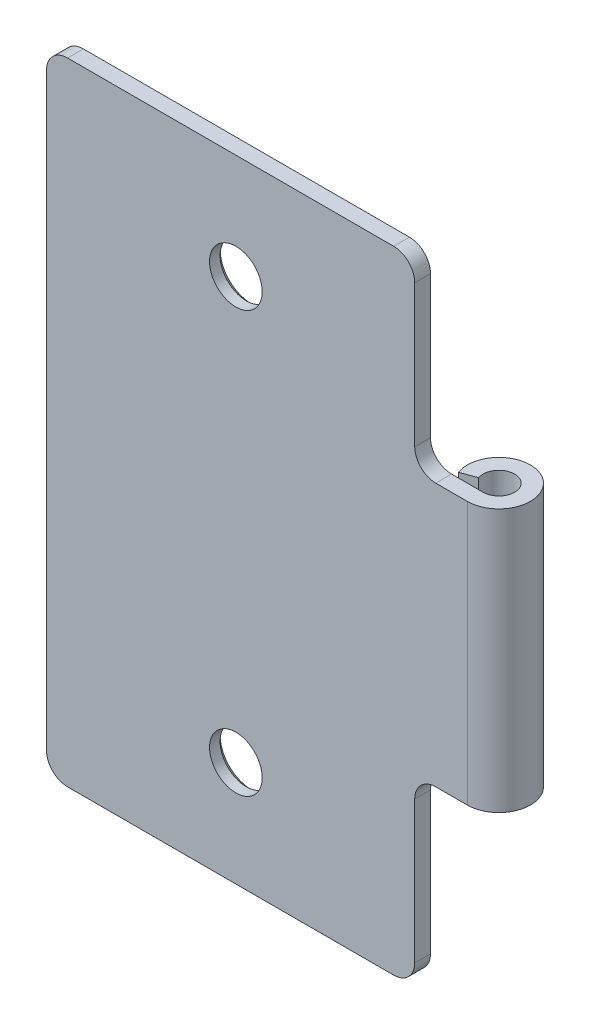
ISO-10303-21;
HEADER;
FILE_DESCRIPTION(('STEP AP214'),'2;1');
FILE_NAME('part.step','',(''),(''),'','','');
FILE_SCHEMA(('AUTOMOTIVE_DESIGN { 1 0 10303 214 1 1 1 1 }'));
ENDSEC;
DATA;
#1=APPLICATION_CONTEXT('core data for automotive mechanical design processes');
#2=APPLICATION_PROTOCOL_DEFINITION('international standard','automotive_design',2000,#1);
#3=PRODUCT_CONTEXT('',#1,'mechanical');
#4=PRODUCT('Part','Part','',(#3));
#5=PRODUCT_RELATED_PRODUCT_CATEGORY('part','',(#4));
#6=PRODUCT_DEFINITION_FORMATION('','',#4);
#7=PRODUCT_DEFINITION_CONTEXT('part definition',#1,'design');
#8=PRODUCT_DEFINITION('design','',#6,#7);
#9=PRODUCT_DEFINITION_SHAPE('','',#8);
#10=(LENGTH_UNIT() NAMED_UNIT(*) SI_UNIT(.MILLI.,.METRE.));
#11=(NAMED_UNIT(*) PLANE_ANGLE_UNIT() SI_UNIT($,.RADIAN.));
#12=(NAMED_UNIT(*) SI_UNIT($,.STERADIAN.) SOLID_ANGLE_UNIT());
#13=UNCERTAINTY_MEASURE_WITH_UNIT(LENGTH_MEASURE(1.E-05),#10,'distance_accuracy_value','');
#14=(GEOMETRIC_REPRESENTATION_CONTEXT(3) GLOBAL_UNCERTAINTY_ASSIGNED_CONTEXT((#13)) GLOBAL_UNIT_ASSIGNED_CONTEXT((#10,
#11,#12)) REPRESENTATION_CONTEXT('',''));
#15=CARTESIAN_POINT('',(0.,0.,0.));
#16=DIRECTION('',(0.,0.,1.));
#17=DIRECTION('',(1.,0.,0.));
#18=AXIS2_PLACEMENT_3D('',#15,#16,#17);
#19=CARTESIAN_POINT('',(10.3135852294402,-1.25,0.15));
#20=DIRECTION('',(0.,1.,0.));
#21=DIRECTION('',(0.,0.,1.));
#22=AXIS2_PLACEMENT_3D('',#19,#20,#21);
#23=PLANE('',#22);
#24=DIRECTION('',(1.,0.,0.));
#25=VECTOR('',#24,1.);
#26=CARTESIAN_POINT('',(10.3135852294402,-1.25,0.15));
#27=LINE('',#26,#25);
#28=CARTESIAN_POINT('',(9.71358522944015,-1.25,0.15));
#29=VERTEX_POINT('',#28);
#30=CARTESIAN_POINT('',(10.0135852294402,-1.25,0.15));
#31=VERTEX_POINT('',#30);
#32=EDGE_CURVE('E156',#29,#31,#27,.T.);
#33=ORIENTED_EDGE('',*,*,#32,.F.);
#34=DIRECTION('',(0.,0.,-1.));
#35=VECTOR('',#34,1.);
#36=CARTESIAN_POINT('',(9.71358522944015,-1.25,0.));
#37=LINE('',#36,#35);
#38=CARTESIAN_POINT('',(9.71358522944015,-1.25,0.));
#39=VERTEX_POINT('',#38);
#40=EDGE_CURVE('E250',#29,#39,#37,.T.);
#41=ORIENTED_EDGE('',*,*,#40,.T.);
#42=DIRECTION('',(1.,0.,0.));
#43=VECTOR('',#42,1.);
#44=CARTESIAN_POINT('',(10.0135852294402,-1.25,0.));
#45=LINE('',#44,#43);
#46=CARTESIAN_POINT('',(10.0135852294402,-1.25,0.));
#47=VERTEX_POINT('',#46);
#48=EDGE_CURVE('E173',#39,#47,#45,.T.);
#49=ORIENTED_EDGE('',*,*,#48,.T.);
#50=DIRECTION('',(0.,0.,1.));
#51=VECTOR('',#50,1.);
#52=CARTESIAN_POINT('',(10.0135852294402,-1.25,0.));
#53=LINE('',#52,#51);
#54=EDGE_CURVE('E170',#47,#31,#53,.T.);
#55=ORIENTED_EDGE('',*,*,#54,.T.);
#56=EDGE_LOOP('',(#33,#41,#49,#55));
#57=FACE_BOUND('',#56,.T.);
#58=ADVANCED_FACE('F45',(#57),#23,.F.);
#59=CARTESIAN_POINT('',(10.0135852294402,3.,-0.15));
#60=DIRECTION('',(0.,-1.,0.));
#61=DIRECTION('',(0.,0.,-1.));
#62=AXIS2_PLACEMENT_3D('',#59,#60,#61);
#63=CYLINDRICAL_SURFACE('',#62,0.3);
#64=DIRECTION('',(0.,-1.,0.));
#65=VECTOR('',#64,1.);
#66=CARTESIAN_POINT('',(9.73167744320438,3.,-0.0473939570023011));
#67=LINE('',#66,#65);
#68=CARTESIAN_POINT('',(9.73167744320438,1.25,-0.0473939570023012));
#69=VERTEX_POINT('',#68);
#70=CARTESIAN_POINT('',(9.73167744320438,-1.25,-0.0473939570023012));
#71=VERTEX_POINT('',#70);
#72=EDGE_CURVE('E177',#69,#71,#67,.T.);
#73=ORIENTED_EDGE('',*,*,#72,.F.);
#74=CARTESIAN_POINT('',(10.0135852294402,1.25,-0.15));
#75=DIRECTION('',(0.,-1.,0.));
#76=DIRECTION('',(0.,0.,-1.));
#77=AXIS2_PLACEMENT_3D('',#74,#75,#76);
#78=CIRCLE('',#77,0.3);
#79=CARTESIAN_POINT('',(10.0135852294402,1.25,0.15));
#80=VERTEX_POINT('',#79);
#81=EDGE_CURVE('E191',#69,#80,#78,.T.);
#82=ORIENTED_EDGE('',*,*,#81,.T.);
#83=DIRECTION('',(0.,-1.,0.));
#84=VECTOR('',#83,1.);
#85=CARTESIAN_POINT('',(10.0135852294402,3.,0.15));
#86=LINE('',#85,#84);
#87=EDGE_CURVE('E162',#80,#31,#86,.T.);
#88=ORIENTED_EDGE('',*,*,#87,.T.);
#89=CARTESIAN_POINT('',(10.0135852294402,-1.25,-0.15));
#90=DIRECTION('',(0.,1.,0.));
#91=DIRECTION('',(0.,0.,1.));
#92=AXIS2_PLACEMENT_3D('',#89,#90,#91);
#93=CIRCLE('',#92,0.3);
#94=EDGE_CURVE('E180',#31,#71,#93,.T.);
#95=ORIENTED_EDGE('',*,*,#94,.T.);
#96=EDGE_LOOP('',(#73,#82,#88,#95));
#97=FACE_BOUND('',#96,.T.);
#98=ADVANCED_FACE('F190',(#97),#63,.T.);
#99=CARTESIAN_POINT('',(9.87263133632226,3.,-0.0986969785011506));
#100=DIRECTION('',(0.342020143325664,0.,0.93969262078591));
#101=DIRECTION('',(0.93969262078591,0.,-0.342020143325664));
#102=AXIS2_PLACEMENT_3D('',#99,#100,#101);
#103=PLANE('',#102);
#104=DIRECTION('',(0.93969262078591,0.,-0.342020143325664));
#105=VECTOR('',#104,1.);
#106=CARTESIAN_POINT('',(9.87263133632226,1.25,-0.0986969785011506));
#107=LINE('',#106,#105);
#108=CARTESIAN_POINT('',(9.87263133632226,1.25,-0.0986969785011505));
#109=VERTEX_POINT('',#108);
#110=EDGE_CURVE('E354',#69,#109,#107,.T.);
#111=ORIENTED_EDGE('',*,*,#110,.F.);
#112=ORIENTED_EDGE('',*,*,#72,.T.);
#113=DIRECTION('',(-0.93969262078591,0.,0.342020143325664));
#114=VECTOR('',#113,1.);
#115=CARTESIAN_POINT('',(9.87263133632226,-1.25,-0.0986969785011506));
#116=LINE('',#115,#114);
#117=CARTESIAN_POINT('',(9.87263133632226,-1.25,-0.0986969785011505));
#118=VERTEX_POINT('',#117);
#119=EDGE_CURVE('E183',#118,#71,#116,.T.);
#120=ORIENTED_EDGE('',*,*,#119,.F.);
#121=DIRECTION('',(0.,-1.,0.));
#122=VECTOR('',#121,1.);
#123=CARTESIAN_POINT('',(9.87263133632226,3.,-0.0986969785011506));
#124=LINE('',#123,#122);
#125=EDGE_CURVE('E210',#109,#118,#124,.T.);
#126=ORIENTED_EDGE('',*,*,#125,.F.);
#127=EDGE_LOOP('',(#111,#112,#120,#126));
#128=FACE_BOUND('',#127,.T.);
#129=ADVANCED_FACE('F291',(#128),#103,.T.);
#130=CARTESIAN_POINT('',(10.0135852294402,3.,-0.15));
#131=DIRECTION('',(0.,-1.,0.));
#132=DIRECTION('',(0.,0.,-1.));
#133=AXIS2_PLACEMENT_3D('',#130,#131,#132);
#134=CYLINDRICAL_SURFACE('',#133,0.15);
#135=CARTESIAN_POINT('',(10.0135852294402,1.25,-0.15));
#136=DIRECTION('',(0.,-1.,0.));
#137=DIRECTION('',(0.,0.,-1.));
#138=AXIS2_PLACEMENT_3D('',#135,#136,#137);
#139=CIRCLE('',#138,0.15);
#140=CARTESIAN_POINT('',(10.0135852294402,1.25,0.));
#141=VERTEX_POINT('',#140);
#142=EDGE_CURVE('E352',#109,#141,#139,.T.);
#143=ORIENTED_EDGE('',*,*,#142,.F.);
#144=ORIENTED_EDGE('',*,*,#125,.T.);
#145=CARTESIAN_POINT('',(10.0135852294402,-1.25,-0.15));
#146=DIRECTION('',(0.,1.,0.));
#147=DIRECTION('',(0.,0.,1.));
#148=AXIS2_PLACEMENT_3D('',#145,#146,#147);
#149=CIRCLE('',#148,0.15);
#150=EDGE_CURVE('E347',#47,#118,#149,.T.);
#151=ORIENTED_EDGE('',*,*,#150,.F.);
#152=DIRECTION('',(0.,-1.,0.));
#153=VECTOR('',#152,1.);
#154=CARTESIAN_POINT('',(10.0135852294402,3.,0.));
#155=LINE('',#154,#153);
#156=EDGE_CURVE('E207',#141,#47,#155,.T.);
#157=ORIENTED_EDGE('',*,*,#156,.F.);
#158=EDGE_LOOP('',(#143,#144,#151,#157));
#159=FACE_BOUND('',#158,.T.);
#160=ADVANCED_FACE('F319',(#159),#134,.F.);
#161=CARTESIAN_POINT('',(10.0135852294402,3.,0.));
#162=DIRECTION('',(0.,0.,-1.));
#163=DIRECTION('',(-1.,0.,0.));
#164=AXIS2_PLACEMENT_3D('',#161,#162,#163);
#165=PLANE('',#164);
#166=CARTESIAN_POINT('',(7.81358522944015,2.,0.));
#167=DIRECTION('',(0.,0.,-1.));
#168=DIRECTION('',(-1.,0.,0.));
#169=AXIS2_PLACEMENT_3D('',#166,#167,#168);
#170=CIRCLE('',#169,0.3);
#171=CARTESIAN_POINT('',(7.51358522944015,2.,0.));
#172=VERTEX_POINT('',#171);
#173=EDGE_CURVE('E400',#172,#172,#170,.T.);
#174=ORIENTED_EDGE('',*,*,#173,.F.);
#175=EDGE_LOOP('',(#174));
#176=FACE_BOUND('',#175,.T.);
#177=CARTESIAN_POINT('',(7.81358522944015,-2.,0.));
#178=DIRECTION('',(0.,0.,-1.));
#179=DIRECTION('',(-1.,0.,0.));
#180=AXIS2_PLACEMENT_3D('',#177,#178,#179);
#181=CIRCLE('',#180,0.3);
#182=CARTESIAN_POINT('',(7.51358522944015,-2.,0.));
#183=VERTEX_POINT('',#182);
#184=EDGE_CURVE('E391',#183,#183,#181,.T.);
#185=ORIENTED_EDGE('',*,*,#184,.F.);
#186=EDGE_LOOP('',(#185));
#187=FACE_BOUND('',#186,.T.);
#188=DIRECTION('',(1.,0.,0.));
#189=VECTOR('',#188,1.);
#190=CARTESIAN_POINT('',(10.0135852294402,3.,0.));
#191=LINE('',#190,#189);
#192=CARTESIAN_POINT('',(6.21358522944015,3.,0.));
#193=VERTEX_POINT('',#192);
#194=CARTESIAN_POINT('',(9.31358522944015,3.,0.));
#195=VERTEX_POINT('',#194);
#196=EDGE_CURVE('E199',#193,#195,#191,.T.);
#197=ORIENTED_EDGE('',*,*,#196,.T.);
#198=CARTESIAN_POINT('',(9.31358522944015,2.8,0.));
#199=DIRECTION('',(0.,0.,-1.));
#200=DIRECTION('',(-1.,0.,0.));
#201=AXIS2_PLACEMENT_3D('',#198,#199,#200);
#202=CIRCLE('',#201,0.2);
#203=CARTESIAN_POINT('',(9.51358522944015,2.8,0.));
#204=VERTEX_POINT('',#203);
#205=EDGE_CURVE('E224',#195,#204,#202,.T.);
#206=ORIENTED_EDGE('',*,*,#205,.T.);
#207=DIRECTION('',(0.,1.,0.));
#208=VECTOR('',#207,1.);
#209=CARTESIAN_POINT('',(9.51358522944015,3.,0.));
#210=LINE('',#209,#208);
#211=CARTESIAN_POINT('',(9.51358522944015,1.45,0.));
#212=VERTEX_POINT('',#211);
#213=EDGE_CURVE('E268',#212,#204,#210,.T.);
#214=ORIENTED_EDGE('',*,*,#213,.F.);
#215=CARTESIAN_POINT('',(9.71358522944015,1.45,0.));
#216=DIRECTION('',(0.,0.,-1.));
#217=DIRECTION('',(-1.,0.,0.));
#218=AXIS2_PLACEMENT_3D('',#215,#216,#217);
#219=CIRCLE('',#218,0.2);
#220=CARTESIAN_POINT('',(9.71358522944015,1.25,0.));
#221=VERTEX_POINT('',#220);
#222=EDGE_CURVE('E257',#212,#221,#219,.F.);
#223=ORIENTED_EDGE('',*,*,#222,.T.);
#224=DIRECTION('',(-1.,0.,0.));
#225=VECTOR('',#224,1.);
#226=CARTESIAN_POINT('',(10.0135852294402,1.25,0.));
#227=LINE('',#226,#225);
#228=EDGE_CURVE('E187',#141,#221,#227,.T.);
#229=ORIENTED_EDGE('',*,*,#228,.F.);
#230=ORIENTED_EDGE('',*,*,#156,.T.);
#231=ORIENTED_EDGE('',*,*,#48,.F.);
#232=CARTESIAN_POINT('',(9.71358522944015,-1.45,0.));
#233=DIRECTION('',(0.,0.,-1.));
#234=DIRECTION('',(-1.,0.,0.));
#235=AXIS2_PLACEMENT_3D('',#232,#233,#234);
#236=CIRCLE('',#235,0.2);
#237=CARTESIAN_POINT('',(9.51358522944015,-1.45,0.));
#238=VERTEX_POINT('',#237);
#239=EDGE_CURVE('E53',#39,#238,#236,.F.);
#240=ORIENTED_EDGE('',*,*,#239,.T.);
#241=DIRECTION('',(0.,1.,0.));
#242=VECTOR('',#241,1.);
#243=CARTESIAN_POINT('',(9.51358522944015,3.,0.));
#244=LINE('',#243,#242);
#245=CARTESIAN_POINT('',(9.51358522944015,-2.8,0.));
#246=VERTEX_POINT('',#245);
#247=EDGE_CURVE('E264',#246,#238,#244,.T.);
#248=ORIENTED_EDGE('',*,*,#247,.F.);
#249=CARTESIAN_POINT('',(9.31358522944015,-2.8,0.));
#250=DIRECTION('',(0.,0.,-1.));
#251=DIRECTION('',(-1.,0.,0.));
#252=AXIS2_PLACEMENT_3D('',#249,#250,#251);
#253=CIRCLE('',#252,0.2);
#254=CARTESIAN_POINT('',(9.31358522944015,-3.,0.));
#255=VERTEX_POINT('',#254);
#256=EDGE_CURVE('E222',#246,#255,#253,.T.);
#257=ORIENTED_EDGE('',*,*,#256,.T.);
#258=DIRECTION('',(1.,0.,0.));
#259=VECTOR('',#258,1.);
#260=CARTESIAN_POINT('',(10.0135852294402,-3.,0.));
#261=LINE('',#260,#259);
#262=CARTESIAN_POINT('',(6.21358522944015,-3.,0.));
#263=VERTEX_POINT('',#262);
#264=EDGE_CURVE('E357',#263,#255,#261,.T.);
#265=ORIENTED_EDGE('',*,*,#264,.F.);
#266=CARTESIAN_POINT('',(6.21358522944015,-2.8,0.));
#267=DIRECTION('',(0.,0.,-1.));
#268=DIRECTION('',(-1.,0.,0.));
#269=AXIS2_PLACEMENT_3D('',#266,#267,#268);
#270=CIRCLE('',#269,0.2);
#271=CARTESIAN_POINT('',(6.01358522944015,-2.8,0.));
#272=VERTEX_POINT('',#271);
#273=EDGE_CURVE('E218',#263,#272,#270,.T.);
#274=ORIENTED_EDGE('',*,*,#273,.T.);
#275=DIRECTION('',(0.,-1.,0.));
#276=VECTOR('',#275,1.);
#277=CARTESIAN_POINT('',(6.01358522944015,3.,0.));
#278=LINE('',#277,#276);
#279=CARTESIAN_POINT('',(6.01358522944015,2.8,0.));
#280=VERTEX_POINT('',#279);
#281=EDGE_CURVE('E196',#280,#272,#278,.T.);
#282=ORIENTED_EDGE('',*,*,#281,.F.);
#283=CARTESIAN_POINT('',(6.21358522944015,2.8,0.));
#284=DIRECTION('',(0.,0.,-1.));
#285=DIRECTION('',(-1.,0.,0.));
#286=AXIS2_PLACEMENT_3D('',#283,#284,#285);
#287=CIRCLE('',#286,0.2);
#288=EDGE_CURVE('E220',#280,#193,#287,.T.);
#289=ORIENTED_EDGE('',*,*,#288,.T.);
#290=EDGE_LOOP('',(#197,#206,#214,#223,#229,#230,#231,#240,#248,#257,#265,#274,#282,#289));
#291=FACE_BOUND('',#290,.T.);
#292=ADVANCED_FACE('F263',(#176,#187,#291),#165,.T.);
#293=CARTESIAN_POINT('',(6.01358522944015,3.,0.15));
#294=DIRECTION('',(-1.,0.,0.));
#295=DIRECTION('',(0.,0.,1.));
#296=AXIS2_PLACEMENT_3D('',#293,#294,#295);
#297=PLANE('',#296);
#298=DIRECTION('',(0.,-1.,0.));
#299=VECTOR('',#298,1.);
#300=CARTESIAN_POINT('',(6.01358522944015,3.,0.15));
#301=LINE('',#300,#299);
#302=CARTESIAN_POINT('',(6.01358522944015,2.8,0.15));
#303=VERTEX_POINT('',#302);
#304=CARTESIAN_POINT('',(6.01358522944015,-2.8,0.15));
#305=VERTEX_POINT('',#304);
#306=EDGE_CURVE('E192',#303,#305,#301,.T.);
#307=ORIENTED_EDGE('',*,*,#306,.F.);
#308=DIRECTION('',(0.,0.,-1.));
#309=VECTOR('',#308,1.);
#310=CARTESIAN_POINT('',(6.01358522944015,2.8,0.15));
#311=LINE('',#310,#309);
#312=EDGE_CURVE('E254',#303,#280,#311,.T.);
#313=ORIENTED_EDGE('',*,*,#312,.T.);
#314=ORIENTED_EDGE('',*,*,#281,.T.);
#315=DIRECTION('',(0.,0.,-1.));
#316=VECTOR('',#315,1.);
#317=CARTESIAN_POINT('',(6.01358522944015,-2.8,0.15));
#318=LINE('',#317,#316);
#319=EDGE_CURVE('E252',#272,#305,#318,.F.);
#320=ORIENTED_EDGE('',*,*,#319,.T.);
#321=EDGE_LOOP('',(#307,#313,#314,#320));
#322=FACE_BOUND('',#321,.T.);
#323=ADVANCED_FACE('F313',(#322),#297,.T.);
#324=CARTESIAN_POINT('',(10.0135852294402,3.,0.15));
#325=DIRECTION('',(0.,0.,-1.));
#326=DIRECTION('',(-1.,0.,0.));
#327=AXIS2_PLACEMENT_3D('',#324,#325,#326);
#328=PLANE('',#327);
#329=CARTESIAN_POINT('',(7.81358522944015,2.,0.15));
#330=DIRECTION('',(0.,0.,-1.));
#331=DIRECTION('',(-1.,0.,0.));
#332=AXIS2_PLACEMENT_3D('',#329,#330,#331);
#333=CIRCLE('',#332,0.25);
#334=CARTESIAN_POINT('',(7.56358522944015,2.,0.15));
#335=VERTEX_POINT('',#334);
#336=EDGE_CURVE('E394',#335,#335,#333,.T.);
#337=ORIENTED_EDGE('',*,*,#336,.T.);
#338=EDGE_LOOP('',(#337));
#339=FACE_BOUND('',#338,.T.);
#340=CARTESIAN_POINT('',(7.81358522944015,-2.,0.15));
#341=DIRECTION('',(0.,0.,-1.));
#342=DIRECTION('',(-1.,0.,0.));
#343=AXIS2_PLACEMENT_3D('',#340,#341,#342);
#344=CIRCLE('',#343,0.25);
#345=CARTESIAN_POINT('',(7.56358522944015,-2.,0.15));
#346=VERTEX_POINT('',#345);
#347=EDGE_CURVE('E167',#346,#346,#344,.T.);
#348=ORIENTED_EDGE('',*,*,#347,.T.);
#349=EDGE_LOOP('',(#348));
#350=FACE_BOUND('',#349,.T.);
#351=DIRECTION('',(0.,1.,0.));
#352=VECTOR('',#351,1.);
#353=CARTESIAN_POINT('',(9.51358522944015,1.25,0.15));
#354=LINE('',#353,#352);
#355=CARTESIAN_POINT('',(9.51358522944015,1.45,0.15));
#356=VERTEX_POINT('',#355);
#357=CARTESIAN_POINT('',(9.51358522944015,2.8,0.15));
#358=VERTEX_POINT('',#357);
#359=EDGE_CURVE('E269',#356,#358,#354,.T.);
#360=ORIENTED_EDGE('',*,*,#359,.T.);
#361=CARTESIAN_POINT('',(9.31358522944015,2.8,0.15));
#362=DIRECTION('',(0.,0.,-1.));
#363=DIRECTION('',(-1.,0.,0.));
#364=AXIS2_PLACEMENT_3D('',#361,#362,#363);
#365=CIRCLE('',#364,0.2);
#366=CARTESIAN_POINT('',(9.31358522944015,3.,0.15));
#367=VERTEX_POINT('',#366);
#368=EDGE_CURVE('E237',#358,#367,#365,.F.);
#369=ORIENTED_EDGE('',*,*,#368,.T.);
#370=DIRECTION('',(1.,0.,0.));
#371=VECTOR('',#370,1.);
#372=CARTESIAN_POINT('',(10.0135852294402,3.,0.15));
#373=LINE('',#372,#371);
#374=CARTESIAN_POINT('',(6.21358522944015,3.,0.15));
#375=VERTEX_POINT('',#374);
#376=EDGE_CURVE('E193',#375,#367,#373,.T.);
#377=ORIENTED_EDGE('',*,*,#376,.F.);
#378=CARTESIAN_POINT('',(6.21358522944015,2.8,0.15));
#379=DIRECTION('',(0.,0.,-1.));
#380=DIRECTION('',(-1.,0.,0.));
#381=AXIS2_PLACEMENT_3D('',#378,#379,#380);
#382=CIRCLE('',#381,0.2);
#383=EDGE_CURVE('E233',#375,#303,#382,.F.);
#384=ORIENTED_EDGE('',*,*,#383,.T.);
#385=ORIENTED_EDGE('',*,*,#306,.T.);
#386=CARTESIAN_POINT('',(6.21358522944015,-2.8,0.15));
#387=DIRECTION('',(0.,0.,-1.));
#388=DIRECTION('',(-1.,0.,0.));
#389=AXIS2_PLACEMENT_3D('',#386,#387,#388);
#390=CIRCLE('',#389,0.2);
#391=CARTESIAN_POINT('',(6.21358522944015,-3.,0.15));
#392=VERTEX_POINT('',#391);
#393=EDGE_CURVE('E231',#305,#392,#390,.F.);
#394=ORIENTED_EDGE('',*,*,#393,.T.);
#395=DIRECTION('',(1.,0.,0.));
#396=VECTOR('',#395,1.);
#397=CARTESIAN_POINT('',(10.0135852294402,-3.,0.15));
#398=LINE('',#397,#396);
#399=CARTESIAN_POINT('',(9.31358522944015,-3.,0.15));
#400=VERTEX_POINT('',#399);
#401=EDGE_CURVE('E202',#392,#400,#398,.T.);
#402=ORIENTED_EDGE('',*,*,#401,.T.);
#403=CARTESIAN_POINT('',(9.31358522944015,-2.8,0.15));
#404=DIRECTION('',(0.,0.,-1.));
#405=DIRECTION('',(-1.,0.,0.));
#406=AXIS2_PLACEMENT_3D('',#403,#404,#405);
#407=CIRCLE('',#406,0.2);
#408=CARTESIAN_POINT('',(9.51358522944015,-2.8,0.15));
#409=VERTEX_POINT('',#408);
#410=EDGE_CURVE('E235',#400,#409,#407,.F.);
#411=ORIENTED_EDGE('',*,*,#410,.T.);
#412=DIRECTION('',(0.,1.,0.));
#413=VECTOR('',#412,1.);
#414=CARTESIAN_POINT('',(9.51358522944015,-1.25,0.15));
#415=LINE('',#414,#413);
#416=CARTESIAN_POINT('',(9.51358522944015,-1.45,0.15));
#417=VERTEX_POINT('',#416);
#418=EDGE_CURVE('E166',#409,#417,#415,.T.);
#419=ORIENTED_EDGE('',*,*,#418,.T.);
#420=CARTESIAN_POINT('',(9.71358522944015,-1.45,0.15));
#421=DIRECTION('',(0.,0.,-1.));
#422=DIRECTION('',(-1.,0.,0.));
#423=AXIS2_PLACEMENT_3D('',#420,#421,#422);
#424=CIRCLE('',#423,0.2);
#425=EDGE_CURVE('E12',#417,#29,#424,.T.);
#426=ORIENTED_EDGE('',*,*,#425,.T.);
#427=ORIENTED_EDGE('',*,*,#32,.T.);
#428=ORIENTED_EDGE('',*,*,#87,.F.);
#429=DIRECTION('',(-1.,0.,0.));
#430=VECTOR('',#429,1.);
#431=CARTESIAN_POINT('',(10.3135852294402,1.25,0.15));
#432=LINE('',#431,#430);
#433=CARTESIAN_POINT('',(9.71358522944015,1.25,0.15));
#434=VERTEX_POINT('',#433);
#435=EDGE_CURVE('E339',#80,#434,#432,.T.);
#436=ORIENTED_EDGE('',*,*,#435,.T.);
#437=CARTESIAN_POINT('',(9.71358522944015,1.45,0.15));
#438=DIRECTION('',(0.,0.,-1.));
#439=DIRECTION('',(-1.,0.,0.));
#440=AXIS2_PLACEMENT_3D('',#437,#438,#439);
#441=CIRCLE('',#440,0.2);
#442=EDGE_CURVE('E259',#434,#356,#441,.T.);
#443=ORIENTED_EDGE('',*,*,#442,.T.);
#444=EDGE_LOOP('',(#360,#369,#377,#384,#385,#394,#402,#411,#419,#426,#427,#428,#436,#443));
#445=FACE_BOUND('',#444,.T.);
#446=ADVANCED_FACE('F159',(#339,#350,#445),#328,.F.);
#447=CARTESIAN_POINT('',(10.0135852294402,3.,-0.15));
#448=DIRECTION('',(0.,1.,0.));
#449=DIRECTION('',(1.,0.,0.));
#450=AXIS2_PLACEMENT_3D('',#447,#448,#449);
#451=PLANE('',#450);
#452=ORIENTED_EDGE('',*,*,#376,.T.);
#453=DIRECTION('',(0.,0.,-1.));
#454=VECTOR('',#453,1.);
#455=CARTESIAN_POINT('',(9.31358522944015,3.,0.));
#456=LINE('',#455,#454);
#457=EDGE_CURVE('E215',#367,#195,#456,.T.);
#458=ORIENTED_EDGE('',*,*,#457,.T.);
#459=ORIENTED_EDGE('',*,*,#196,.F.);
#460=DIRECTION('',(0.,0.,-1.));
#461=VECTOR('',#460,1.);
#462=CARTESIAN_POINT('',(6.21358522944015,3.,-0.15));
#463=LINE('',#462,#461);
#464=EDGE_CURVE('E176',#193,#375,#463,.F.);
#465=ORIENTED_EDGE('',*,*,#464,.T.);
#466=EDGE_LOOP('',(#452,#458,#459,#465));
#467=FACE_BOUND('',#466,.T.);
#468=ADVANCED_FACE('F302',(#467),#451,.T.);
#469=CARTESIAN_POINT('',(10.0135852294402,-3.,-0.15));
#470=DIRECTION('',(0.,1.,0.));
#471=DIRECTION('',(1.,0.,0.));
#472=AXIS2_PLACEMENT_3D('',#469,#470,#471);
#473=PLANE('',#472);
#474=ORIENTED_EDGE('',*,*,#264,.T.);
#475=DIRECTION('',(0.,0.,-1.));
#476=VECTOR('',#475,1.);
#477=CARTESIAN_POINT('',(9.31358522944015,-3.,-0.15));
#478=LINE('',#477,#476);
#479=EDGE_CURVE('E246',#255,#400,#478,.F.);
#480=ORIENTED_EDGE('',*,*,#479,.T.);
#481=ORIENTED_EDGE('',*,*,#401,.F.);
#482=DIRECTION('',(0.,0.,-1.));
#483=VECTOR('',#482,1.);
#484=CARTESIAN_POINT('',(6.21358522944015,-3.,0.));
#485=LINE('',#484,#483);
#486=EDGE_CURVE('E243',#392,#263,#485,.T.);
#487=ORIENTED_EDGE('',*,*,#486,.T.);
#488=EDGE_LOOP('',(#474,#480,#481,#487));
#489=FACE_BOUND('',#488,.T.);
#490=ADVANCED_FACE('F295',(#489),#473,.F.);
#491=ORIENTED_EDGE('',*,*,#54,.F.);
#492=ORIENTED_EDGE('',*,*,#150,.T.);
#493=ORIENTED_EDGE('',*,*,#119,.T.);
#494=ORIENTED_EDGE('',*,*,#94,.F.);
#495=EDGE_LOOP('',(#491,#492,#493,#494));
#496=FACE_BOUND('',#495,.T.);
#497=ADVANCED_FACE('F181',(#496),#23,.F.);
#498=CARTESIAN_POINT('',(9.51358522944015,-1.25,0.15));
#499=DIRECTION('',(-1.,0.,0.));
#500=DIRECTION('',(0.,0.,1.));
#501=AXIS2_PLACEMENT_3D('',#498,#499,#500);
#502=PLANE('',#501);
#503=ORIENTED_EDGE('',*,*,#418,.F.);
#504=DIRECTION('',(0.,0.,-1.));
#505=VECTOR('',#504,1.);
#506=CARTESIAN_POINT('',(9.51358522944015,-2.8,0.15));
#507=LINE('',#506,#505);
#508=EDGE_CURVE('E240',#409,#246,#507,.T.);
#509=ORIENTED_EDGE('',*,*,#508,.T.);
#510=ORIENTED_EDGE('',*,*,#247,.T.);
#511=DIRECTION('',(0.,0.,-1.));
#512=VECTOR('',#511,1.);
#513=CARTESIAN_POINT('',(9.51358522944015,-1.45,0.15));
#514=LINE('',#513,#512);
#515=EDGE_CURVE('E66',#238,#417,#514,.F.);
#516=ORIENTED_EDGE('',*,*,#515,.T.);
#517=EDGE_LOOP('',(#503,#509,#510,#516));
#518=FACE_BOUND('',#517,.T.);
#519=ADVANCED_FACE('F266',(#518),#502,.F.);
#520=CARTESIAN_POINT('',(10.3135852294402,1.25,0.15));
#521=DIRECTION('',(0.,-1.,0.));
#522=DIRECTION('',(0.,0.,-1.));
#523=AXIS2_PLACEMENT_3D('',#520,#521,#522);
#524=PLANE('',#523);
#525=ORIENTED_EDGE('',*,*,#228,.T.);
#526=DIRECTION('',(0.,0.,-1.));
#527=VECTOR('',#526,1.);
#528=CARTESIAN_POINT('',(9.71358522944015,1.25,0.15));
#529=LINE('',#528,#527);
#530=EDGE_CURVE('E248',#221,#434,#529,.F.);
#531=ORIENTED_EDGE('',*,*,#530,.T.);
#532=ORIENTED_EDGE('',*,*,#435,.F.);
#533=ORIENTED_EDGE('',*,*,#81,.F.);
#534=ORIENTED_EDGE('',*,*,#110,.T.);
#535=ORIENTED_EDGE('',*,*,#142,.T.);
#536=EDGE_LOOP('',(#525,#531,#532,#533,#534,#535));
#537=FACE_BOUND('',#536,.T.);
#538=ADVANCED_FACE('F300',(#537),#524,.F.);
#539=CARTESIAN_POINT('',(9.51358522944015,1.25,0.15));
#540=DIRECTION('',(-1.,0.,0.));
#541=DIRECTION('',(0.,0.,1.));
#542=AXIS2_PLACEMENT_3D('',#539,#540,#541);
#543=PLANE('',#542);
#544=ORIENTED_EDGE('',*,*,#213,.T.);
#545=DIRECTION('',(0.,0.,-1.));
#546=VECTOR('',#545,1.);
#547=CARTESIAN_POINT('',(9.51358522944015,2.8,0.15));
#548=LINE('',#547,#546);
#549=EDGE_CURVE('E229',#204,#358,#548,.F.);
#550=ORIENTED_EDGE('',*,*,#549,.T.);
#551=ORIENTED_EDGE('',*,*,#359,.F.);
#552=DIRECTION('',(0.,0.,-1.));
#553=VECTOR('',#552,1.);
#554=CARTESIAN_POINT('',(9.51358522944015,1.45,0.));
#555=LINE('',#554,#553);
#556=EDGE_CURVE('E226',#356,#212,#555,.T.);
#557=ORIENTED_EDGE('',*,*,#556,.T.);
#558=EDGE_LOOP('',(#544,#550,#551,#557));
#559=FACE_BOUND('',#558,.T.);
#560=ADVANCED_FACE('F329',(#559),#543,.F.);
#561=CARTESIAN_POINT('',(9.31358522944015,2.8,-0.15));
#562=DIRECTION('',(0.,0.,1.));
#563=DIRECTION('',(1.,0.,0.));
#564=AXIS2_PLACEMENT_3D('',#561,#562,#563);
#565=CYLINDRICAL_SURFACE('',#564,0.2);
#566=ORIENTED_EDGE('',*,*,#368,.F.);
#567=ORIENTED_EDGE('',*,*,#549,.F.);
#568=ORIENTED_EDGE('',*,*,#205,.F.);
#569=ORIENTED_EDGE('',*,*,#457,.F.);
#570=EDGE_LOOP('',(#566,#567,#568,#569));
#571=FACE_BOUND('',#570,.T.);
#572=ADVANCED_FACE('F326',(#571),#565,.T.);
#573=CARTESIAN_POINT('',(9.31358522944015,-2.8,0.15));
#574=DIRECTION('',(0.,0.,-1.));
#575=DIRECTION('',(-1.,0.,0.));
#576=AXIS2_PLACEMENT_3D('',#573,#574,#575);
#577=CYLINDRICAL_SURFACE('',#576,0.2);
#578=ORIENTED_EDGE('',*,*,#410,.F.);
#579=ORIENTED_EDGE('',*,*,#479,.F.);
#580=ORIENTED_EDGE('',*,*,#256,.F.);
#581=ORIENTED_EDGE('',*,*,#508,.F.);
#582=EDGE_LOOP('',(#578,#579,#580,#581));
#583=FACE_BOUND('',#582,.T.);
#584=ADVANCED_FACE('F281',(#583),#577,.T.);
#585=CARTESIAN_POINT('',(9.71358522944015,1.45,0.15));
#586=DIRECTION('',(0.,0.,1.));
#587=DIRECTION('',(1.,0.,0.));
#588=AXIS2_PLACEMENT_3D('',#585,#586,#587);
#589=CYLINDRICAL_SURFACE('',#588,0.2);
#590=ORIENTED_EDGE('',*,*,#442,.F.);
#591=ORIENTED_EDGE('',*,*,#530,.F.);
#592=ORIENTED_EDGE('',*,*,#222,.F.);
#593=ORIENTED_EDGE('',*,*,#556,.F.);
#594=EDGE_LOOP('',(#590,#591,#592,#593));
#595=FACE_BOUND('',#594,.T.);
#596=ADVANCED_FACE('F274',(#595),#589,.F.);
#597=CARTESIAN_POINT('',(9.71358522944015,-1.45,0.15));
#598=DIRECTION('',(0.,0.,1.));
#599=DIRECTION('',(1.,0.,0.));
#600=AXIS2_PLACEMENT_3D('',#597,#598,#599);
#601=CYLINDRICAL_SURFACE('',#600,0.2);
#602=ORIENTED_EDGE('',*,*,#425,.F.);
#603=ORIENTED_EDGE('',*,*,#515,.F.);
#604=ORIENTED_EDGE('',*,*,#239,.F.);
#605=ORIENTED_EDGE('',*,*,#40,.F.);
#606=EDGE_LOOP('',(#602,#603,#604,#605));
#607=FACE_BOUND('',#606,.T.);
#608=ADVANCED_FACE('F271',(#607),#601,.F.);
#609=CARTESIAN_POINT('',(6.21358522944015,2.8,0.15));
#610=DIRECTION('',(0.,0.,-1.));
#611=DIRECTION('',(-1.,0.,0.));
#612=AXIS2_PLACEMENT_3D('',#609,#610,#611);
#613=CYLINDRICAL_SURFACE('',#612,0.2);
#614=ORIENTED_EDGE('',*,*,#383,.F.);
#615=ORIENTED_EDGE('',*,*,#464,.F.);
#616=ORIENTED_EDGE('',*,*,#288,.F.);
#617=ORIENTED_EDGE('',*,*,#312,.F.);
#618=EDGE_LOOP('',(#614,#615,#616,#617));
#619=FACE_BOUND('',#618,.T.);
#620=ADVANCED_FACE('F273',(#619),#613,.T.);
#621=CARTESIAN_POINT('',(6.21358522944015,-2.8,-0.15));
#622=DIRECTION('',(0.,0.,1.));
#623=DIRECTION('',(1.,0.,0.));
#624=AXIS2_PLACEMENT_3D('',#621,#622,#623);
#625=CYLINDRICAL_SURFACE('',#624,0.2);
#626=ORIENTED_EDGE('',*,*,#393,.F.);
#627=ORIENTED_EDGE('',*,*,#319,.F.);
#628=ORIENTED_EDGE('',*,*,#273,.F.);
#629=ORIENTED_EDGE('',*,*,#486,.F.);
#630=EDGE_LOOP('',(#626,#627,#628,#629));
#631=FACE_BOUND('',#630,.T.);
#632=ADVANCED_FACE('F47',(#631),#625,.T.);
#633=CARTESIAN_POINT('',(7.81358522944015,-2.,0.));
#634=DIRECTION('',(0.,0.,-1.));
#635=DIRECTION('',(-1.,0.,0.));
#636=AXIS2_PLACEMENT_3D('',#633,#634,#635);
#637=CYLINDRICAL_SURFACE('',#636,0.25);
#638=ORIENTED_EDGE('',*,*,#347,.F.);
#639=EDGE_LOOP('',(#638));
#640=FACE_BOUND('',#639,.T.);
#641=CARTESIAN_POINT('',(7.81358522944015,-2.,0.0500000000000001));
#642=DIRECTION('',(0.,0.,-1.));
#643=DIRECTION('',(-1.,0.,0.));
#644=AXIS2_PLACEMENT_3D('',#641,#642,#643);
#645=CIRCLE('',#644,0.25);
#646=CARTESIAN_POINT('',(7.56358522944015,-2.,0.0500000000000001));
#647=VERTEX_POINT('',#646);
#648=EDGE_CURVE('E388',#647,#647,#645,.T.);
#649=ORIENTED_EDGE('',*,*,#648,.T.);
#650=EDGE_LOOP('',(#649));
#651=FACE_BOUND('',#650,.T.);
#652=ADVANCED_FACE('F411',(#640,#651),#637,.F.);
#653=CARTESIAN_POINT('',(7.81358522944015,-2.,0.));
#654=DIRECTION('',(0.,0.,-1.));
#655=DIRECTION('',(-1.,0.,0.));
#656=AXIS2_PLACEMENT_3D('',#653,#654,#655);
#657=CONICAL_SURFACE('',#656,0.3,0.785398163397445);
#658=ORIENTED_EDGE('',*,*,#648,.F.);
#659=EDGE_LOOP('',(#658));
#660=FACE_BOUND('',#659,.T.);
#661=ORIENTED_EDGE('',*,*,#184,.T.);
#662=EDGE_LOOP('',(#661));
#663=FACE_BOUND('',#662,.T.);
#664=ADVANCED_FACE('F408',(#660,#663),#657,.F.);
#665=CARTESIAN_POINT('',(7.81358522944015,2.,0.));
#666=DIRECTION('',(0.,0.,-1.));
#667=DIRECTION('',(-1.,0.,0.));
#668=AXIS2_PLACEMENT_3D('',#665,#666,#667);
#669=CYLINDRICAL_SURFACE('',#668,0.25);
#670=ORIENTED_EDGE('',*,*,#336,.F.);
#671=EDGE_LOOP('',(#670));
#672=FACE_BOUND('',#671,.T.);
#673=CARTESIAN_POINT('',(7.81358522944015,2.,0.0500000000000001));
#674=DIRECTION('',(0.,0.,-1.));
#675=DIRECTION('',(-1.,0.,0.));
#676=AXIS2_PLACEMENT_3D('',#673,#674,#675);
#677=CIRCLE('',#676,0.25);
#678=CARTESIAN_POINT('',(7.56358522944015,2.,0.0500000000000001));
#679=VERTEX_POINT('',#678);
#680=EDGE_CURVE('E397',#679,#679,#677,.T.);
#681=ORIENTED_EDGE('',*,*,#680,.T.);
#682=EDGE_LOOP('',(#681));
#683=FACE_BOUND('',#682,.T.);
#684=ADVANCED_FACE('F410',(#672,#683),#669,.F.);
#685=CARTESIAN_POINT('',(7.81358522944015,2.,0.));
#686=DIRECTION('',(0.,0.,-1.));
#687=DIRECTION('',(-1.,0.,0.));
#688=AXIS2_PLACEMENT_3D('',#685,#686,#687);
#689=CONICAL_SURFACE('',#688,0.3,0.785398163397445);
#690=ORIENTED_EDGE('',*,*,#680,.F.);
#691=EDGE_LOOP('',(#690));
#692=FACE_BOUND('',#691,.T.);
#693=ORIENTED_EDGE('',*,*,#173,.T.);
#694=EDGE_LOOP('',(#693));
#695=FACE_BOUND('',#694,.T.);
#696=ADVANCED_FACE('F404',(#692,#695),#689,.F.);
#697=CLOSED_SHELL('',(#58,#98,#129,#160,#292,#323,#446,#468,#490,#497,#519,#538,#560,#572,#584,
#596,#608,#620,#632,#652,#664,#684,#696));
#698=MANIFOLD_SOLID_BREP('B2',#697);
#699=ADVANCED_BREP_SHAPE_REPRESENTATION('',(#18,#698),#14);
#700=SHAPE_DEFINITION_REPRESENTATION(#9,#699);
ENDSEC;
END-ISO-10303-21;
